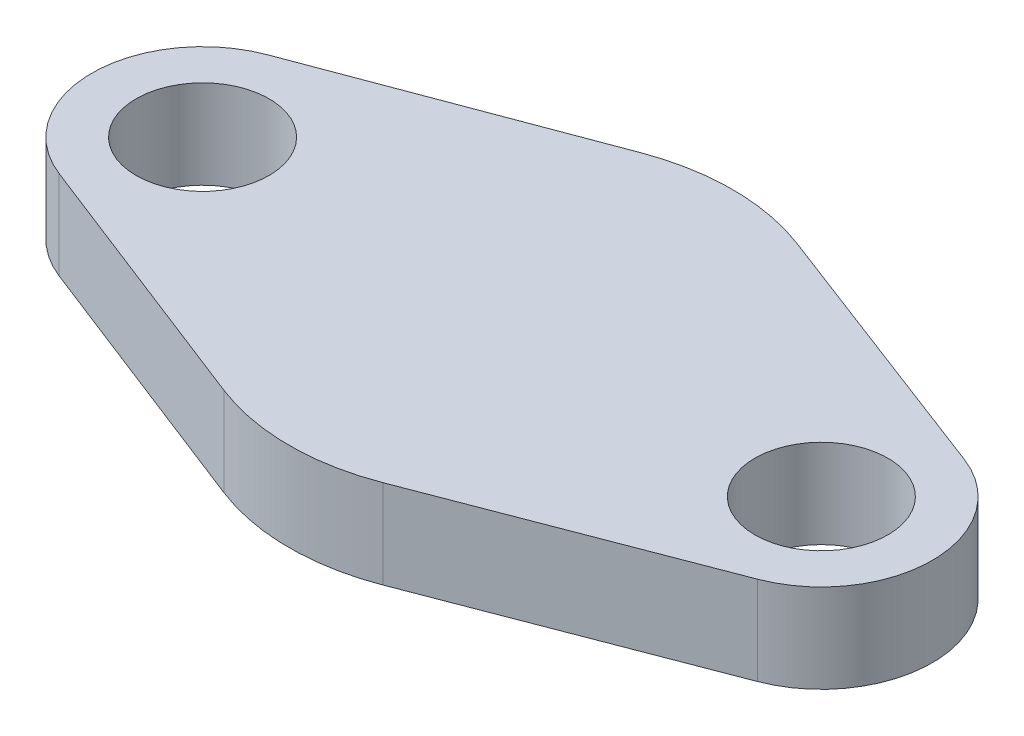
ISO-10303-21;
HEADER;
FILE_DESCRIPTION(('STEP AP214'),'2;1');
FILE_NAME('part.step','',(''),(''),'','','');
FILE_SCHEMA(('AUTOMOTIVE_DESIGN { 1 0 10303 214 1 1 1 1 }'));
ENDSEC;
DATA;
#1=APPLICATION_CONTEXT('core data for automotive mechanical design processes');
#2=APPLICATION_PROTOCOL_DEFINITION('international standard','automotive_design',2000,#1);
#3=PRODUCT_CONTEXT('',#1,'mechanical');
#4=PRODUCT('Part','Part','',(#3));
#5=PRODUCT_RELATED_PRODUCT_CATEGORY('part','',(#4));
#6=PRODUCT_DEFINITION_FORMATION('','',#4);
#7=PRODUCT_DEFINITION_CONTEXT('part definition',#1,'design');
#8=PRODUCT_DEFINITION('design','',#6,#7);
#9=PRODUCT_DEFINITION_SHAPE('','',#8);
#10=(LENGTH_UNIT() NAMED_UNIT(*) SI_UNIT(.MILLI.,.METRE.));
#11=(NAMED_UNIT(*) PLANE_ANGLE_UNIT() SI_UNIT($,.RADIAN.));
#12=(NAMED_UNIT(*) SI_UNIT($,.STERADIAN.) SOLID_ANGLE_UNIT());
#13=UNCERTAINTY_MEASURE_WITH_UNIT(LENGTH_MEASURE(1.E-05),#10,'distance_accuracy_value','');
#14=(GEOMETRIC_REPRESENTATION_CONTEXT(3) GLOBAL_UNCERTAINTY_ASSIGNED_CONTEXT((#13)) GLOBAL_UNIT_ASSIGNED_CONTEXT((#10,
#11,#12)) REPRESENTATION_CONTEXT('',''));
#15=CARTESIAN_POINT('',(0.,0.,0.));
#16=DIRECTION('',(0.,0.,1.));
#17=DIRECTION('',(1.,0.,0.));
#18=AXIS2_PLACEMENT_3D('',#15,#16,#17);
#19=CARTESIAN_POINT('',(69.9999921528156,-20.,-0.0331452222624423));
#20=DIRECTION('',(0.,1.,0.));
#21=DIRECTION('',(0.,0.,1.));
#22=AXIS2_PLACEMENT_3D('',#19,#20,#21);
#23=CYLINDRICAL_SURFACE('',#22,25.);
#24=CARTESIAN_POINT('',(69.9999921528156,0.,-0.0331452222624423));
#25=DIRECTION('',(0.,-1.,0.));
#26=DIRECTION('',(0.,0.,-1.));
#27=AXIS2_PLACEMENT_3D('',#24,#25,#26);
#28=CIRCLE('',#27,25.);
#29=CARTESIAN_POINT('',(78.9175056921311,0.,-23.3886146518441));
#30=VERTEX_POINT('',#29);
#31=CARTESIAN_POINT('',(78.9396194688102,0.,23.3138687934768));
#32=VERTEX_POINT('',#31);
#33=EDGE_CURVE('E133',#30,#32,#28,.T.);
#34=ORIENTED_EDGE('',*,*,#33,.T.);
#35=DIRECTION('',(0.,1.,0.));
#36=VECTOR('',#35,1.);
#37=CARTESIAN_POINT('',(78.9396194688102,-20.,23.3138687934768));
#38=LINE('',#37,#36);
#39=CARTESIAN_POINT('',(78.9396194688102,-20.,23.3138687934768));
#40=VERTEX_POINT('',#39);
#41=EDGE_CURVE('E11',#40,#32,#38,.T.);
#42=ORIENTED_EDGE('',*,*,#41,.F.);
#43=CARTESIAN_POINT('',(69.9999921528156,-20.,-0.0331452222624423));
#44=DIRECTION('',(0.,-1.,0.));
#45=DIRECTION('',(0.,0.,-1.));
#46=AXIS2_PLACEMENT_3D('',#43,#44,#45);
#47=CIRCLE('',#46,25.);
#48=CARTESIAN_POINT('',(78.9175056921311,-20.,-23.3886146518441));
#49=VERTEX_POINT('',#48);
#50=EDGE_CURVE('E148',#49,#40,#47,.T.);
#51=ORIENTED_EDGE('',*,*,#50,.F.);
#52=DIRECTION('',(0.,1.,0.));
#53=VECTOR('',#52,1.);
#54=CARTESIAN_POINT('',(78.9175056921311,-20.,-23.3886146518441));
#55=LINE('',#54,#53);
#56=EDGE_CURVE('E129',#49,#30,#55,.T.);
#57=ORIENTED_EDGE('',*,*,#56,.T.);
#58=EDGE_LOOP('',(#34,#42,#51,#57));
#59=FACE_BOUND('',#58,.T.);
#60=ADVANCED_FACE('F37',(#59),#23,.T.);
#61=CARTESIAN_POINT('',(17.8792546319892,-20.,46.6940280314785));
#62=DIRECTION('',(-0.357585092639783,0.,-0.933880560629569));
#63=DIRECTION('',(-0.933880560629569,0.,0.357585092639783));
#64=AXIS2_PLACEMENT_3D('',#61,#62,#63);
#65=PLANE('',#64);
#66=DIRECTION('',(-0.933880560629569,0.,0.357585092639783));
#67=VECTOR('',#66,1.);
#68=CARTESIAN_POINT('',(17.8792546319892,0.,46.6940280314785));
#69=LINE('',#68,#67);
#70=CARTESIAN_POINT('',(17.8792546319892,0.,46.6940280314785));
#71=VERTEX_POINT('',#70);
#72=EDGE_CURVE('E136',#32,#71,#69,.T.);
#73=ORIENTED_EDGE('',*,*,#72,.T.);
#74=DIRECTION('',(0.,1.,0.));
#75=VECTOR('',#74,1.);
#76=CARTESIAN_POINT('',(17.8792546319892,-20.,46.6940280314785));
#77=LINE('',#76,#75);
#78=CARTESIAN_POINT('',(17.8792546319892,-20.,46.6940280314785));
#79=VERTEX_POINT('',#78);
#80=EDGE_CURVE('E45',#79,#71,#77,.T.);
#81=ORIENTED_EDGE('',*,*,#80,.F.);
#82=DIRECTION('',(-0.933880560629569,0.,0.357585092639783));
#83=VECTOR('',#82,1.);
#84=CARTESIAN_POINT('',(17.8792546319892,-20.,46.6940280314785));
#85=LINE('',#84,#83);
#86=EDGE_CURVE('E96',#40,#79,#85,.T.);
#87=ORIENTED_EDGE('',*,*,#86,.F.);
#88=ORIENTED_EDGE('',*,*,#41,.T.);
#89=EDGE_LOOP('',(#73,#81,#87,#88));
#90=FACE_BOUND('',#89,.T.);
#91=ADVANCED_FACE('F215',(#90),#65,.F.);
#92=CARTESIAN_POINT('',(0.,-20.,0.));
#93=DIRECTION('',(0.,1.,0.));
#94=DIRECTION('',(0.,0.,1.));
#95=AXIS2_PLACEMENT_3D('',#92,#93,#94);
#96=CYLINDRICAL_SURFACE('',#95,50.);
#97=CARTESIAN_POINT('',(0.,0.,0.));
#98=DIRECTION('',(0.,-1.,0.));
#99=DIRECTION('',(0.,0.,-1.));
#100=AXIS2_PLACEMENT_3D('',#97,#98,#99);
#101=CIRCLE('',#100,50.);
#102=CARTESIAN_POINT('',(-18.1568826975564,0.,46.5867750623198));
#103=VERTEX_POINT('',#102);
#104=EDGE_CURVE('E139',#71,#103,#101,.T.);
#105=ORIENTED_EDGE('',*,*,#104,.T.);
#106=DIRECTION('',(0.,1.,0.));
#107=VECTOR('',#106,1.);
#108=CARTESIAN_POINT('',(-18.1568826975564,-20.,46.5867750623198));
#109=LINE('',#108,#107);
#110=CARTESIAN_POINT('',(-18.1568826975564,-20.,46.5867750623198));
#111=VERTEX_POINT('',#110);
#112=EDGE_CURVE('E155',#111,#103,#109,.T.);
#113=ORIENTED_EDGE('',*,*,#112,.F.);
#114=CARTESIAN_POINT('',(0.,-20.,0.));
#115=DIRECTION('',(0.,-1.,0.));
#116=DIRECTION('',(0.,0.,-1.));
#117=AXIS2_PLACEMENT_3D('',#114,#115,#116);
#118=CIRCLE('',#117,50.);
#119=EDGE_CURVE('E163',#79,#111,#118,.T.);
#120=ORIENTED_EDGE('',*,*,#119,.F.);
#121=ORIENTED_EDGE('',*,*,#80,.T.);
#122=EDGE_LOOP('',(#105,#113,#120,#121));
#123=FACE_BOUND('',#122,.T.);
#124=ADVANCED_FACE('F161',(#123),#96,.T.);
#125=CARTESIAN_POINT('',(-79.0769960781902,-20.,22.8435700198086));
#126=DIRECTION('',(0.363137653951129,0.,-0.931735501246395));
#127=DIRECTION('',(-0.931735501246395,0.,-0.363137653951129));
#128=AXIS2_PLACEMENT_3D('',#125,#126,#127);
#129=PLANE('',#128);
#130=DIRECTION('',(-0.931735501246395,0.,-0.363137653951129));
#131=VECTOR('',#130,1.);
#132=CARTESIAN_POINT('',(-79.0769960781902,0.,22.8435700198086));
#133=LINE('',#132,#131);
#134=CARTESIAN_POINT('',(-79.0769960781902,0.,22.8435700198086));
#135=VERTEX_POINT('',#134);
#136=EDGE_CURVE('E141',#103,#135,#133,.T.);
#137=ORIENTED_EDGE('',*,*,#136,.T.);
#138=DIRECTION('',(0.,1.,0.));
#139=VECTOR('',#138,1.);
#140=CARTESIAN_POINT('',(-79.0769960781902,-20.,22.8435700198086));
#141=LINE('',#140,#139);
#142=CARTESIAN_POINT('',(-79.0769960781902,-20.,22.8435700198086));
#143=VERTEX_POINT('',#142);
#144=EDGE_CURVE('E152',#143,#135,#141,.T.);
#145=ORIENTED_EDGE('',*,*,#144,.F.);
#146=DIRECTION('',(-0.931735501246395,0.,-0.363137653951129));
#147=VECTOR('',#146,1.);
#148=CARTESIAN_POINT('',(-79.0769960781902,-20.,22.8435700198086));
#149=LINE('',#148,#147);
#150=EDGE_CURVE('E175',#111,#143,#149,.T.);
#151=ORIENTED_EDGE('',*,*,#150,.F.);
#152=ORIENTED_EDGE('',*,*,#112,.T.);
#153=EDGE_LOOP('',(#137,#145,#151,#152));
#154=FACE_BOUND('',#153,.T.);
#155=ADVANCED_FACE('F171',(#154),#129,.F.);
#156=CARTESIAN_POINT('',(-69.998554729412,-20.,-0.449817511351326));
#157=DIRECTION('',(0.,1.,0.));
#158=DIRECTION('',(0.,0.,1.));
#159=AXIS2_PLACEMENT_3D('',#156,#157,#158);
#160=CYLINDRICAL_SURFACE('',#159,25.);
#161=CARTESIAN_POINT('',(-69.998554729412,0.,-0.449817511351326));
#162=DIRECTION('',(0.,-1.,0.));
#163=DIRECTION('',(0.,0.,-1.));
#164=AXIS2_PLACEMENT_3D('',#161,#162,#163);
#165=CIRCLE('',#164,25.);
#166=CARTESIAN_POINT('',(-78.7768875463001,0.,-23.8579544076518));
#167=VERTEX_POINT('',#166);
#168=EDGE_CURVE('E143',#135,#167,#165,.T.);
#169=ORIENTED_EDGE('',*,*,#168,.T.);
#170=DIRECTION('',(0.,1.,0.));
#171=VECTOR('',#170,1.);
#172=CARTESIAN_POINT('',(-78.7768875463001,-20.,-23.8579544076518));
#173=LINE('',#172,#171);
#174=CARTESIAN_POINT('',(-78.7768875463001,-20.,-23.8579544076518));
#175=VERTEX_POINT('',#174);
#176=EDGE_CURVE('E124',#175,#167,#173,.T.);
#177=ORIENTED_EDGE('',*,*,#176,.F.);
#178=CARTESIAN_POINT('',(-69.998554729412,-20.,-0.449817511351326));
#179=DIRECTION('',(0.,-1.,0.));
#180=DIRECTION('',(0.,0.,-1.));
#181=AXIS2_PLACEMENT_3D('',#178,#179,#180);
#182=CIRCLE('',#181,25.);
#183=EDGE_CURVE('E115',#143,#175,#182,.T.);
#184=ORIENTED_EDGE('',*,*,#183,.F.);
#185=ORIENTED_EDGE('',*,*,#144,.T.);
#186=EDGE_LOOP('',(#169,#177,#184,#185));
#187=FACE_BOUND('',#186,.T.);
#188=ADVANCED_FACE('F174',(#187),#160,.T.);
#189=CARTESIAN_POINT('',(-17.5566656337762,-20.,-46.816273792601));
#190=DIRECTION('',(0.351133312675524,0.,0.93632547585202));
#191=DIRECTION('',(0.93632547585202,0.,-0.351133312675524));
#192=AXIS2_PLACEMENT_3D('',#189,#190,#191);
#193=PLANE('',#192);
#194=DIRECTION('',(0.93632547585202,0.,-0.351133312675524));
#195=VECTOR('',#194,1.);
#196=CARTESIAN_POINT('',(-17.5566656337762,0.,-46.816273792601));
#197=LINE('',#196,#195);
#198=CARTESIAN_POINT('',(-17.5566656337762,0.,-46.816273792601));
#199=VERTEX_POINT('',#198);
#200=EDGE_CURVE('E123',#167,#199,#197,.T.);
#201=ORIENTED_EDGE('',*,*,#200,.T.);
#202=DIRECTION('',(0.,1.,0.));
#203=VECTOR('',#202,1.);
#204=CARTESIAN_POINT('',(-17.5566656337762,-20.,-46.816273792601));
#205=LINE('',#204,#203);
#206=CARTESIAN_POINT('',(-17.5566656337762,-20.,-46.816273792601));
#207=VERTEX_POINT('',#206);
#208=EDGE_CURVE('E120',#207,#199,#205,.T.);
#209=ORIENTED_EDGE('',*,*,#208,.F.);
#210=DIRECTION('',(0.93632547585202,0.,-0.351133312675524));
#211=VECTOR('',#210,1.);
#212=CARTESIAN_POINT('',(-17.5566656337762,-20.,-46.816273792601));
#213=LINE('',#212,#211);
#214=EDGE_CURVE('E109',#175,#207,#213,.T.);
#215=ORIENTED_EDGE('',*,*,#214,.F.);
#216=ORIENTED_EDGE('',*,*,#176,.T.);
#217=EDGE_LOOP('',(#201,#209,#215,#216));
#218=FACE_BOUND('',#217,.T.);
#219=ADVANCED_FACE('F121',(#218),#193,.F.);
#220=CARTESIAN_POINT('',(0.,-20.,0.));
#221=DIRECTION('',(0.,1.,0.));
#222=DIRECTION('',(0.,0.,1.));
#223=AXIS2_PLACEMENT_3D('',#220,#221,#222);
#224=CYLINDRICAL_SURFACE('',#223,50.);
#225=CARTESIAN_POINT('',(0.,0.,0.));
#226=DIRECTION('',(0.,-1.,0.));
#227=DIRECTION('',(0.,0.,-1.));
#228=AXIS2_PLACEMENT_3D('',#225,#226,#227);
#229=CIRCLE('',#228,50.);
#230=CARTESIAN_POINT('',(17.835027078631,0.,-46.7109388591634));
#231=VERTEX_POINT('',#230);
#232=EDGE_CURVE('E82',#199,#231,#229,.T.);
#233=ORIENTED_EDGE('',*,*,#232,.T.);
#234=DIRECTION('',(0.,1.,0.));
#235=VECTOR('',#234,1.);
#236=CARTESIAN_POINT('',(17.835027078631,-20.,-46.7109388591634));
#237=LINE('',#236,#235);
#238=CARTESIAN_POINT('',(17.835027078631,-20.,-46.7109388591634));
#239=VERTEX_POINT('',#238);
#240=EDGE_CURVE('E125',#239,#231,#237,.T.);
#241=ORIENTED_EDGE('',*,*,#240,.F.);
#242=CARTESIAN_POINT('',(0.,-20.,0.));
#243=DIRECTION('',(0.,-1.,0.));
#244=DIRECTION('',(0.,0.,-1.));
#245=AXIS2_PLACEMENT_3D('',#242,#243,#244);
#246=CIRCLE('',#245,50.);
#247=EDGE_CURVE('E113',#207,#239,#246,.T.);
#248=ORIENTED_EDGE('',*,*,#247,.F.);
#249=ORIENTED_EDGE('',*,*,#208,.T.);
#250=EDGE_LOOP('',(#233,#241,#248,#249));
#251=FACE_BOUND('',#250,.T.);
#252=ADVANCED_FACE('F127',(#251),#224,.T.);
#253=CARTESIAN_POINT('',(78.9175056921311,-20.,-23.3886146518441));
#254=DIRECTION('',(-0.35670054157262,0.,0.934218777183267));
#255=DIRECTION('',(0.934218777183267,0.,0.35670054157262));
#256=AXIS2_PLACEMENT_3D('',#253,#254,#255);
#257=PLANE('',#256);
#258=DIRECTION('',(0.934218777183267,0.,0.35670054157262));
#259=VECTOR('',#258,1.);
#260=CARTESIAN_POINT('',(78.9175056921311,0.,-23.3886146518441));
#261=LINE('',#260,#259);
#262=EDGE_CURVE('E88',#231,#30,#261,.T.);
#263=ORIENTED_EDGE('',*,*,#262,.T.);
#264=ORIENTED_EDGE('',*,*,#56,.F.);
#265=DIRECTION('',(0.934218777183267,0.,0.35670054157262));
#266=VECTOR('',#265,1.);
#267=CARTESIAN_POINT('',(78.9175056921311,-20.,-23.3886146518441));
#268=LINE('',#267,#266);
#269=EDGE_CURVE('E53',#239,#49,#268,.T.);
#270=ORIENTED_EDGE('',*,*,#269,.F.);
#271=ORIENTED_EDGE('',*,*,#240,.T.);
#272=EDGE_LOOP('',(#263,#264,#270,#271));
#273=FACE_BOUND('',#272,.T.);
#274=ADVANCED_FACE('F222',(#273),#257,.F.);
#275=CARTESIAN_POINT('',(69.9999921528156,-20.,-0.0331452222624423));
#276=DIRECTION('',(0.,-1.,0.));
#277=DIRECTION('',(0.,0.,-1.));
#278=AXIS2_PLACEMENT_3D('',#275,#276,#277);
#279=PLANE('',#278);
#280=CARTESIAN_POINT('',(-69.998554729412,-20.,-0.449817511351326));
#281=DIRECTION('',(0.,1.,0.));
#282=DIRECTION('',(0.,0.,1.));
#283=AXIS2_PLACEMENT_3D('',#280,#281,#282);
#284=CIRCLE('',#283,15.);
#285=CARTESIAN_POINT('',(-69.998554729412,-20.,14.5501824886487));
#286=VERTEX_POINT('',#285);
#287=EDGE_CURVE('E137',#286,#286,#284,.T.);
#288=ORIENTED_EDGE('',*,*,#287,.T.);
#289=EDGE_LOOP('',(#288));
#290=FACE_BOUND('',#289,.T.);
#291=CARTESIAN_POINT('',(69.9999921528156,-20.,-0.0331452222624423));
#292=DIRECTION('',(0.,1.,0.));
#293=DIRECTION('',(0.,0.,1.));
#294=AXIS2_PLACEMENT_3D('',#291,#292,#293);
#295=CIRCLE('',#294,15.);
#296=CARTESIAN_POINT('',(69.9999921528156,-20.,14.9668547777376));
#297=VERTEX_POINT('',#296);
#298=EDGE_CURVE('E184',#297,#297,#295,.T.);
#299=ORIENTED_EDGE('',*,*,#298,.T.);
#300=EDGE_LOOP('',(#299));
#301=FACE_BOUND('',#300,.T.);
#302=ORIENTED_EDGE('',*,*,#50,.T.);
#303=ORIENTED_EDGE('',*,*,#86,.T.);
#304=ORIENTED_EDGE('',*,*,#119,.T.);
#305=ORIENTED_EDGE('',*,*,#150,.T.);
#306=ORIENTED_EDGE('',*,*,#183,.T.);
#307=ORIENTED_EDGE('',*,*,#214,.T.);
#308=ORIENTED_EDGE('',*,*,#247,.T.);
#309=ORIENTED_EDGE('',*,*,#269,.T.);
#310=EDGE_LOOP('',(#302,#303,#304,#305,#306,#307,#308,#309));
#311=FACE_BOUND('',#310,.T.);
#312=ADVANCED_FACE('F111',(#290,#301,#311),#279,.T.);
#313=CARTESIAN_POINT('',(69.9999921528156,0.,-0.0331452222624423));
#314=DIRECTION('',(0.,-1.,0.));
#315=DIRECTION('',(0.,0.,-1.));
#316=AXIS2_PLACEMENT_3D('',#313,#314,#315);
#317=PLANE('',#316);
#318=CARTESIAN_POINT('',(-69.998554729412,0.,-0.449817511351326));
#319=DIRECTION('',(0.,1.,0.));
#320=DIRECTION('',(0.,0.,1.));
#321=AXIS2_PLACEMENT_3D('',#318,#319,#320);
#322=CIRCLE('',#321,15.);
#323=CARTESIAN_POINT('',(-69.998554729412,0.,14.5501824886487));
#324=VERTEX_POINT('',#323);
#325=EDGE_CURVE('E187',#324,#324,#322,.T.);
#326=ORIENTED_EDGE('',*,*,#325,.F.);
#327=EDGE_LOOP('',(#326));
#328=FACE_BOUND('',#327,.T.);
#329=CARTESIAN_POINT('',(69.9999921528156,0.,-0.0331452222624423));
#330=DIRECTION('',(0.,1.,0.));
#331=DIRECTION('',(0.,0.,1.));
#332=AXIS2_PLACEMENT_3D('',#329,#330,#331);
#333=CIRCLE('',#332,15.);
#334=CARTESIAN_POINT('',(69.9999921528156,0.,14.9668547777376));
#335=VERTEX_POINT('',#334);
#336=EDGE_CURVE('E181',#335,#335,#333,.T.);
#337=ORIENTED_EDGE('',*,*,#336,.F.);
#338=EDGE_LOOP('',(#337));
#339=FACE_BOUND('',#338,.T.);
#340=ORIENTED_EDGE('',*,*,#33,.F.);
#341=ORIENTED_EDGE('',*,*,#262,.F.);
#342=ORIENTED_EDGE('',*,*,#232,.F.);
#343=ORIENTED_EDGE('',*,*,#200,.F.);
#344=ORIENTED_EDGE('',*,*,#168,.F.);
#345=ORIENTED_EDGE('',*,*,#136,.F.);
#346=ORIENTED_EDGE('',*,*,#104,.F.);
#347=ORIENTED_EDGE('',*,*,#72,.F.);
#348=EDGE_LOOP('',(#340,#341,#342,#343,#344,#345,#346,#347));
#349=FACE_BOUND('',#348,.T.);
#350=ADVANCED_FACE('F167',(#328,#339,#349),#317,.F.);
#351=CARTESIAN_POINT('',(69.9999921528156,-20.,-0.0331452222624423));
#352=DIRECTION('',(0.,1.,0.));
#353=DIRECTION('',(0.,0.,1.));
#354=AXIS2_PLACEMENT_3D('',#351,#352,#353);
#355=CYLINDRICAL_SURFACE('',#354,15.);
#356=ORIENTED_EDGE('',*,*,#298,.F.);
#357=EDGE_LOOP('',(#356));
#358=FACE_BOUND('',#357,.T.);
#359=ORIENTED_EDGE('',*,*,#336,.T.);
#360=EDGE_LOOP('',(#359));
#361=FACE_BOUND('',#360,.T.);
#362=ADVANCED_FACE('F198',(#358,#361),#355,.F.);
#363=CARTESIAN_POINT('',(-69.998554729412,-20.,-0.449817511351326));
#364=DIRECTION('',(0.,1.,0.));
#365=DIRECTION('',(0.,0.,1.));
#366=AXIS2_PLACEMENT_3D('',#363,#364,#365);
#367=CYLINDRICAL_SURFACE('',#366,15.);
#368=ORIENTED_EDGE('',*,*,#287,.F.);
#369=EDGE_LOOP('',(#368));
#370=FACE_BOUND('',#369,.T.);
#371=ORIENTED_EDGE('',*,*,#325,.T.);
#372=EDGE_LOOP('',(#371));
#373=FACE_BOUND('',#372,.T.);
#374=ADVANCED_FACE('F195',(#370,#373),#367,.F.);
#375=CLOSED_SHELL('',(#60,#91,#124,#155,#188,#219,#252,#274,#312,#350,#362,#374));
#376=MANIFOLD_SOLID_BREP('B2',#375);
#377=ADVANCED_BREP_SHAPE_REPRESENTATION('',(#18,#376),#14);
#378=SHAPE_DEFINITION_REPRESENTATION(#9,#377);
ENDSEC;
END-ISO-10303-21;
